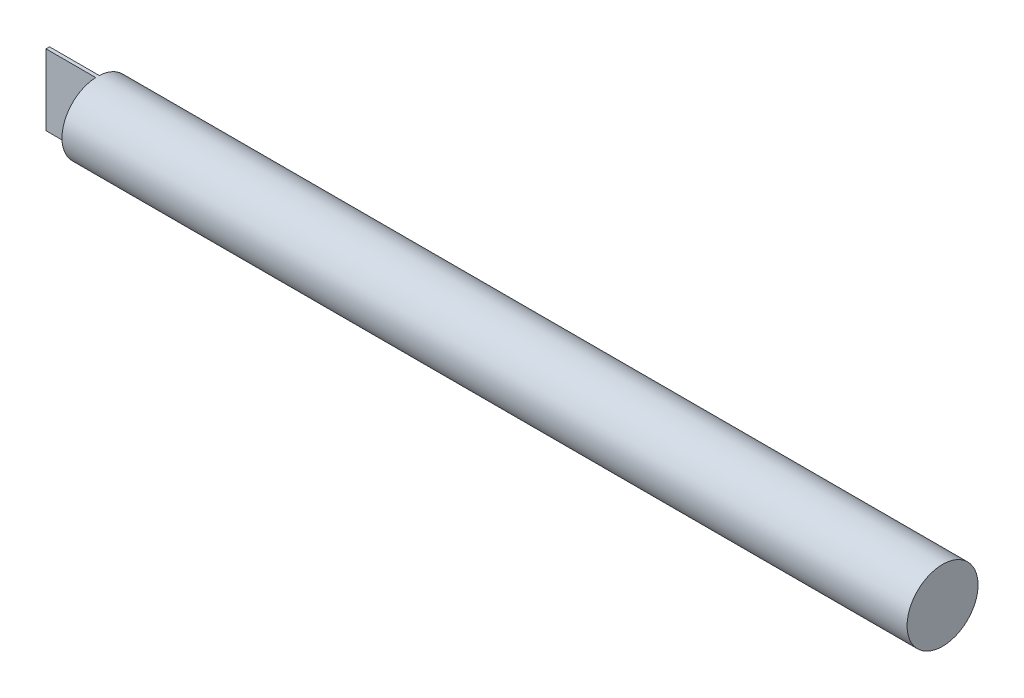
ISO-10303-21;
HEADER;
FILE_DESCRIPTION(('STEP AP214'),'2;1');
FILE_NAME('part.step','',(''),(''),'','','');
FILE_SCHEMA(('AUTOMOTIVE_DESIGN { 1 0 10303 214 1 1 1 1 }'));
ENDSEC;
DATA;
#1=APPLICATION_CONTEXT('core data for automotive mechanical design processes');
#2=APPLICATION_PROTOCOL_DEFINITION('international standard','automotive_design',2000,#1);
#3=PRODUCT_CONTEXT('',#1,'mechanical');
#4=PRODUCT('Part','Part','',(#3));
#5=PRODUCT_RELATED_PRODUCT_CATEGORY('part','',(#4));
#6=PRODUCT_DEFINITION_FORMATION('','',#4);
#7=PRODUCT_DEFINITION_CONTEXT('part definition',#1,'design');
#8=PRODUCT_DEFINITION('design','',#6,#7);
#9=PRODUCT_DEFINITION_SHAPE('','',#8);
#10=(LENGTH_UNIT() NAMED_UNIT(*) SI_UNIT(.MILLI.,.METRE.));
#11=(NAMED_UNIT(*) PLANE_ANGLE_UNIT() SI_UNIT($,.RADIAN.));
#12=(NAMED_UNIT(*) SI_UNIT($,.STERADIAN.) SOLID_ANGLE_UNIT());
#13=UNCERTAINTY_MEASURE_WITH_UNIT(LENGTH_MEASURE(1.E-05),#10,'distance_accuracy_value','');
#14=(GEOMETRIC_REPRESENTATION_CONTEXT(3) GLOBAL_UNCERTAINTY_ASSIGNED_CONTEXT((#13)) GLOBAL_UNIT_ASSIGNED_CONTEXT((#10,
#11,#12)) REPRESENTATION_CONTEXT('',''));
#15=CARTESIAN_POINT('',(0.,0.,0.));
#16=DIRECTION('',(0.,0.,1.));
#17=DIRECTION('',(1.,0.,0.));
#18=AXIS2_PLACEMENT_3D('',#15,#16,#17);
#19=CARTESIAN_POINT('',(-63.,0.,0.));
#20=DIRECTION('',(1.,0.,0.));
#21=DIRECTION('',(0.,0.,-1.));
#22=AXIS2_PLACEMENT_3D('',#19,#20,#21);
#23=PLANE('',#22);
#24=DIRECTION('',(0.,1.,0.));
#25=VECTOR('',#24,1.);
#26=CARTESIAN_POINT('',(-63.,0.,0.250000000000005));
#27=LINE('',#26,#25);
#28=CARTESIAN_POINT('',(-63.,-4.99374608885955,0.250000000000005));
#29=VERTEX_POINT('',#28);
#30=CARTESIAN_POINT('',(-63.,4.99374608885955,0.250000000000005));
#31=VERTEX_POINT('',#30);
#32=EDGE_CURVE('E79',#29,#31,#27,.T.);
#33=ORIENTED_EDGE('',*,*,#32,.T.);
#34=CARTESIAN_POINT('',(-63.,0.,0.));
#35=DIRECTION('',(-1.,0.,0.));
#36=DIRECTION('',(0.,0.,1.));
#37=AXIS2_PLACEMENT_3D('',#34,#35,#36);
#38=CIRCLE('',#37,5.);
#39=CARTESIAN_POINT('',(-63.,4.99374608885955,-0.249999999999995));
#40=VERTEX_POINT('',#39);
#41=EDGE_CURVE('E11',#31,#40,#38,.T.);
#42=ORIENTED_EDGE('',*,*,#41,.T.);
#43=DIRECTION('',(0.,1.,0.));
#44=VECTOR('',#43,1.);
#45=CARTESIAN_POINT('',(-63.,0.,-0.249999999999995));
#46=LINE('',#45,#44);
#47=CARTESIAN_POINT('',(-63.,-4.99374608885955,-0.249999999999995));
#48=VERTEX_POINT('',#47);
#49=EDGE_CURVE('E100',#48,#40,#46,.T.);
#50=ORIENTED_EDGE('',*,*,#49,.F.);
#51=EDGE_CURVE('E47',#48,#29,#38,.T.);
#52=ORIENTED_EDGE('',*,*,#51,.T.);
#53=EDGE_LOOP('',(#33,#42,#50,#52));
#54=FACE_BOUND('',#53,.T.);
#55=ADVANCED_FACE('F39',(#54),#23,.F.);
#56=CARTESIAN_POINT('',(-63.,0.,0.));
#57=DIRECTION('',(-1.,0.,0.));
#58=DIRECTION('',(0.,0.,1.));
#59=AXIS2_PLACEMENT_3D('',#56,#57,#58);
#60=CYLINDRICAL_SURFACE('',#59,5.00000000000001);
#61=CARTESIAN_POINT('',(63.,0.,0.));
#62=DIRECTION('',(-1.,0.,0.));
#63=DIRECTION('',(0.,0.,1.));
#64=AXIS2_PLACEMENT_3D('',#61,#62,#63);
#65=CIRCLE('',#64,5.00000000000002);
#66=CARTESIAN_POINT('',(63.,0.,5.00000000000002));
#67=VERTEX_POINT('',#66);
#68=EDGE_CURVE('E102',#67,#67,#65,.T.);
#69=ORIENTED_EDGE('',*,*,#68,.T.);
#70=EDGE_LOOP('',(#69));
#71=FACE_BOUND('',#70,.T.);
#72=DIRECTION('',(-1.,0.,0.));
#73=VECTOR('',#72,1.);
#74=CARTESIAN_POINT('',(-56.,4.99374608885955,0.250000000000005));
#75=LINE('',#74,#73);
#76=CARTESIAN_POINT('',(-56.,4.99374608885955,0.250000000000005));
#77=VERTEX_POINT('',#76);
#78=EDGE_CURVE('E85',#77,#31,#75,.T.);
#79=ORIENTED_EDGE('',*,*,#78,.F.);
#80=CARTESIAN_POINT('',(-56.,0.,0.));
#81=DIRECTION('',(-1.,0.,0.));
#82=DIRECTION('',(0.,0.,1.));
#83=AXIS2_PLACEMENT_3D('',#80,#81,#82);
#84=CIRCLE('',#83,5.);
#85=CARTESIAN_POINT('',(-56.,-4.99374608885956,0.250000000000005));
#86=VERTEX_POINT('',#85);
#87=EDGE_CURVE('E96',#86,#77,#84,.T.);
#88=ORIENTED_EDGE('',*,*,#87,.F.);
#89=DIRECTION('',(-1.,0.,0.));
#90=VECTOR('',#89,1.);
#91=CARTESIAN_POINT('',(-56.,-4.99374608885955,0.250000000000005));
#92=LINE('',#91,#90);
#93=EDGE_CURVE('E82',#86,#29,#92,.T.);
#94=ORIENTED_EDGE('',*,*,#93,.T.);
#95=ORIENTED_EDGE('',*,*,#51,.F.);
#96=DIRECTION('',(-1.,0.,0.));
#97=VECTOR('',#96,1.);
#98=CARTESIAN_POINT('',(-56.,-4.99374608885955,-0.249999999999995));
#99=LINE('',#98,#97);
#100=CARTESIAN_POINT('',(-56.,-4.99374608885955,-0.249999999999995));
#101=VERTEX_POINT('',#100);
#102=EDGE_CURVE('E110',#101,#48,#99,.T.);
#103=ORIENTED_EDGE('',*,*,#102,.F.);
#104=CARTESIAN_POINT('',(-56.,0.,0.));
#105=DIRECTION('',(-1.,0.,0.));
#106=DIRECTION('',(0.,0.,1.));
#107=AXIS2_PLACEMENT_3D('',#104,#105,#106);
#108=CIRCLE('',#107,5.);
#109=CARTESIAN_POINT('',(-56.,4.99374608885956,-0.249999999999995));
#110=VERTEX_POINT('',#109);
#111=EDGE_CURVE('E118',#110,#101,#108,.T.);
#112=ORIENTED_EDGE('',*,*,#111,.F.);
#113=DIRECTION('',(-1.,0.,0.));
#114=VECTOR('',#113,1.);
#115=CARTESIAN_POINT('',(-56.,4.99374608885955,-0.249999999999995));
#116=LINE('',#115,#114);
#117=EDGE_CURVE('E90',#110,#40,#116,.T.);
#118=ORIENTED_EDGE('',*,*,#117,.T.);
#119=ORIENTED_EDGE('',*,*,#41,.F.);
#120=EDGE_LOOP('',(#79,#88,#94,#95,#103,#112,#118,#119));
#121=FACE_BOUND('',#120,.T.);
#122=ADVANCED_FACE('F94',(#71,#121),#60,.T.);
#123=CARTESIAN_POINT('',(63.,5.00000000000002,0.));
#124=DIRECTION('',(-1.,0.,0.));
#125=DIRECTION('',(0.,0.,1.));
#126=AXIS2_PLACEMENT_3D('',#123,#124,#125);
#127=PLANE('',#126);
#128=ORIENTED_EDGE('',*,*,#68,.F.);
#129=EDGE_LOOP('',(#128));
#130=FACE_BOUND('',#129,.T.);
#131=ADVANCED_FACE('F132',(#130),#127,.F.);
#132=CARTESIAN_POINT('',(-56.,0.,-0.249999999999995));
#133=DIRECTION('',(0.,0.,1.));
#134=DIRECTION('',(1.,0.,0.));
#135=AXIS2_PLACEMENT_3D('',#132,#133,#134);
#136=PLANE('',#135);
#137=ORIENTED_EDGE('',*,*,#49,.T.);
#138=ORIENTED_EDGE('',*,*,#117,.F.);
#139=DIRECTION('',(0.,1.,0.));
#140=VECTOR('',#139,1.);
#141=CARTESIAN_POINT('',(-56.,0.,-0.249999999999995));
#142=LINE('',#141,#140);
#143=EDGE_CURVE('E60',#101,#110,#142,.T.);
#144=ORIENTED_EDGE('',*,*,#143,.F.);
#145=ORIENTED_EDGE('',*,*,#102,.T.);
#146=EDGE_LOOP('',(#137,#138,#144,#145));
#147=FACE_BOUND('',#146,.T.);
#148=ADVANCED_FACE('F129',(#147),#136,.F.);
#149=CARTESIAN_POINT('',(-56.,0.,0.));
#150=DIRECTION('',(-1.,0.,0.));
#151=DIRECTION('',(0.,0.,1.));
#152=AXIS2_PLACEMENT_3D('',#149,#150,#151);
#153=PLANE('',#152);
#154=ORIENTED_EDGE('',*,*,#111,.T.);
#155=ORIENTED_EDGE('',*,*,#143,.T.);
#156=EDGE_LOOP('',(#154,#155));
#157=FACE_BOUND('',#156,.T.);
#158=ADVANCED_FACE('F131',(#157),#153,.T.);
#159=CARTESIAN_POINT('',(-56.,0.,0.250000000000005));
#160=DIRECTION('',(0.,0.,1.));
#161=DIRECTION('',(1.,0.,0.));
#162=AXIS2_PLACEMENT_3D('',#159,#160,#161);
#163=PLANE('',#162);
#164=ORIENTED_EDGE('',*,*,#32,.F.);
#165=ORIENTED_EDGE('',*,*,#93,.F.);
#166=DIRECTION('',(0.,1.,0.));
#167=VECTOR('',#166,1.);
#168=CARTESIAN_POINT('',(-56.,0.,0.250000000000005));
#169=LINE('',#168,#167);
#170=EDGE_CURVE('E53',#86,#77,#169,.T.);
#171=ORIENTED_EDGE('',*,*,#170,.T.);
#172=ORIENTED_EDGE('',*,*,#78,.T.);
#173=EDGE_LOOP('',(#164,#165,#171,#172));
#174=FACE_BOUND('',#173,.T.);
#175=ADVANCED_FACE('F81',(#174),#163,.T.);
#176=CARTESIAN_POINT('',(-56.,0.,0.));
#177=DIRECTION('',(-1.,0.,0.));
#178=DIRECTION('',(0.,0.,1.));
#179=AXIS2_PLACEMENT_3D('',#176,#177,#178);
#180=PLANE('',#179);
#181=ORIENTED_EDGE('',*,*,#170,.F.);
#182=ORIENTED_EDGE('',*,*,#87,.T.);
#183=EDGE_LOOP('',(#181,#182));
#184=FACE_BOUND('',#183,.T.);
#185=ADVANCED_FACE('F126',(#184),#180,.T.);
#186=CLOSED_SHELL('',(#55,#122,#131,#148,#158,#175,#185));
#187=MANIFOLD_SOLID_BREP('B2',#186);
#188=ADVANCED_BREP_SHAPE_REPRESENTATION('',(#18,#187),#14);
#189=SHAPE_DEFINITION_REPRESENTATION(#9,#188);
ENDSEC;
END-ISO-10303-21;
